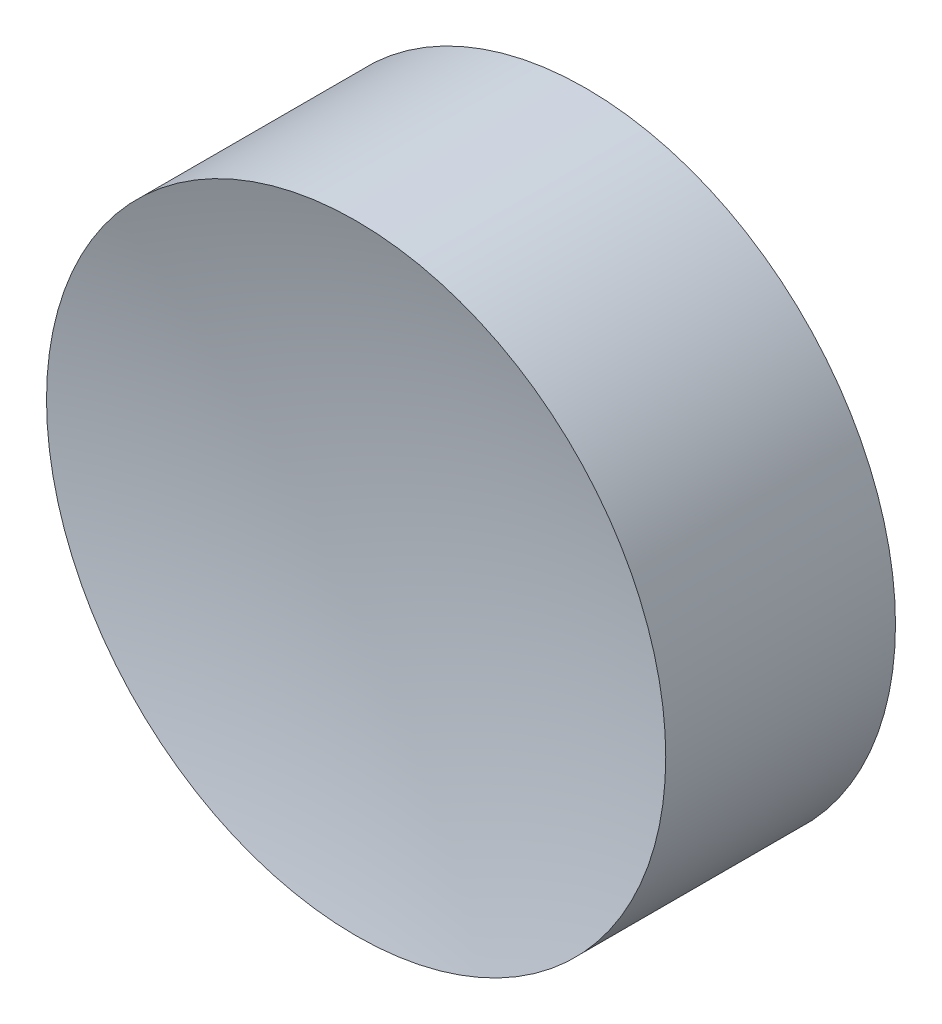
ISO-10303-21;
HEADER;
FILE_DESCRIPTION(('STEP AP214'),'2;1');
FILE_NAME('part.step','',(''),(''),'','','');
FILE_SCHEMA(('AUTOMOTIVE_DESIGN { 1 0 10303 214 1 1 1 1 }'));
ENDSEC;
DATA;
#1=APPLICATION_CONTEXT('core data for automotive mechanical design processes');
#2=APPLICATION_PROTOCOL_DEFINITION('international standard','automotive_design',2000,#1);
#3=PRODUCT_CONTEXT('',#1,'mechanical');
#4=PRODUCT('Part','Part','',(#3));
#5=PRODUCT_RELATED_PRODUCT_CATEGORY('part','',(#4));
#6=PRODUCT_DEFINITION_FORMATION('','',#4);
#7=PRODUCT_DEFINITION_CONTEXT('part definition',#1,'design');
#8=PRODUCT_DEFINITION('design','',#6,#7);
#9=PRODUCT_DEFINITION_SHAPE('','',#8);
#10=(LENGTH_UNIT() NAMED_UNIT(*) SI_UNIT(.MILLI.,.METRE.));
#11=(NAMED_UNIT(*) PLANE_ANGLE_UNIT() SI_UNIT($,.RADIAN.));
#12=(NAMED_UNIT(*) SI_UNIT($,.STERADIAN.) SOLID_ANGLE_UNIT());
#13=UNCERTAINTY_MEASURE_WITH_UNIT(LENGTH_MEASURE(1.E-05),#10,'distance_accuracy_value','');
#14=(GEOMETRIC_REPRESENTATION_CONTEXT(3) GLOBAL_UNCERTAINTY_ASSIGNED_CONTEXT((#13)) GLOBAL_UNIT_ASSIGNED_CONTEXT((#10,
#11,#12)) REPRESENTATION_CONTEXT('',''));
#15=CARTESIAN_POINT('',(0.,0.,0.));
#16=DIRECTION('',(0.,0.,1.));
#17=DIRECTION('',(1.,0.,0.));
#18=AXIS2_PLACEMENT_3D('',#15,#16,#17);
#19=CARTESIAN_POINT('',(0.,0.,-25.49));
#20=DIRECTION('',(0.,0.,1.));
#21=DIRECTION('',(0.,-1.,0.));
#22=AXIS2_PLACEMENT_3D('',#19,#20,#21);
#23=SPHERICAL_SURFACE('',#22,23.99);
#24=CARTESIAN_POINT('',(0.,0.,-2.35566188541371));
#25=DIRECTION('',(0.,0.,1.));
#26=DIRECTION('',(1.,0.,0.));
#27=AXIS2_PLACEMENT_3D('',#24,#25,#26);
#28=CIRCLE('',#27,6.35);
#29=CARTESIAN_POINT('',(6.35,0.,-2.35566188541371));
#30=VERTEX_POINT('',#29);
#31=EDGE_CURVE('E20',#30,#30,#28,.T.);
#32=ORIENTED_EDGE('',*,*,#31,.F.);
#33=EDGE_LOOP('',(#32));
#34=FACE_BOUND('',#33,.T.);
#35=ADVANCED_FACE('F14',(#34),#23,.F.);
#36=CARTESIAN_POINT('',(0.,0.,25.49));
#37=DIRECTION('',(0.,0.,1.));
#38=DIRECTION('',(0.,1.,0.));
#39=AXIS2_PLACEMENT_3D('',#36,#37,#38);
#40=SPHERICAL_SURFACE('',#39,23.99);
#41=CARTESIAN_POINT('',(0.,0.,2.35566188541371));
#42=DIRECTION('',(0.,0.,1.));
#43=DIRECTION('',(1.,0.,0.));
#44=AXIS2_PLACEMENT_3D('',#41,#42,#43);
#45=CIRCLE('',#44,6.35);
#46=CARTESIAN_POINT('',(6.35,0.,2.35566188541371));
#47=VERTEX_POINT('',#46);
#48=EDGE_CURVE('E10',#47,#47,#45,.T.);
#49=ORIENTED_EDGE('',*,*,#48,.T.);
#50=EDGE_LOOP('',(#49));
#51=FACE_BOUND('',#50,.T.);
#52=ADVANCED_FACE('F29',(#51),#40,.F.);
#53=CARTESIAN_POINT('',(0.,0.,7.4634013119058));
#54=DIRECTION('',(0.,0.,1.));
#55=DIRECTION('',(1.,0.,0.));
#56=AXIS2_PLACEMENT_3D('',#53,#54,#55);
#57=CYLINDRICAL_SURFACE('',#56,6.35);
#58=ORIENTED_EDGE('',*,*,#48,.F.);
#59=EDGE_LOOP('',(#58));
#60=FACE_BOUND('',#59,.T.);
#61=ORIENTED_EDGE('',*,*,#31,.T.);
#62=EDGE_LOOP('',(#61));
#63=FACE_BOUND('',#62,.T.);
#64=ADVANCED_FACE('F26',(#60,#63),#57,.T.);
#65=CLOSED_SHELL('',(#35,#52,#64));
#66=MANIFOLD_SOLID_BREP('B1',#65);
#67=ADVANCED_BREP_SHAPE_REPRESENTATION('',(#18,#66),#14);
#68=SHAPE_DEFINITION_REPRESENTATION(#9,#67);
ENDSEC;
END-ISO-10303-21;
